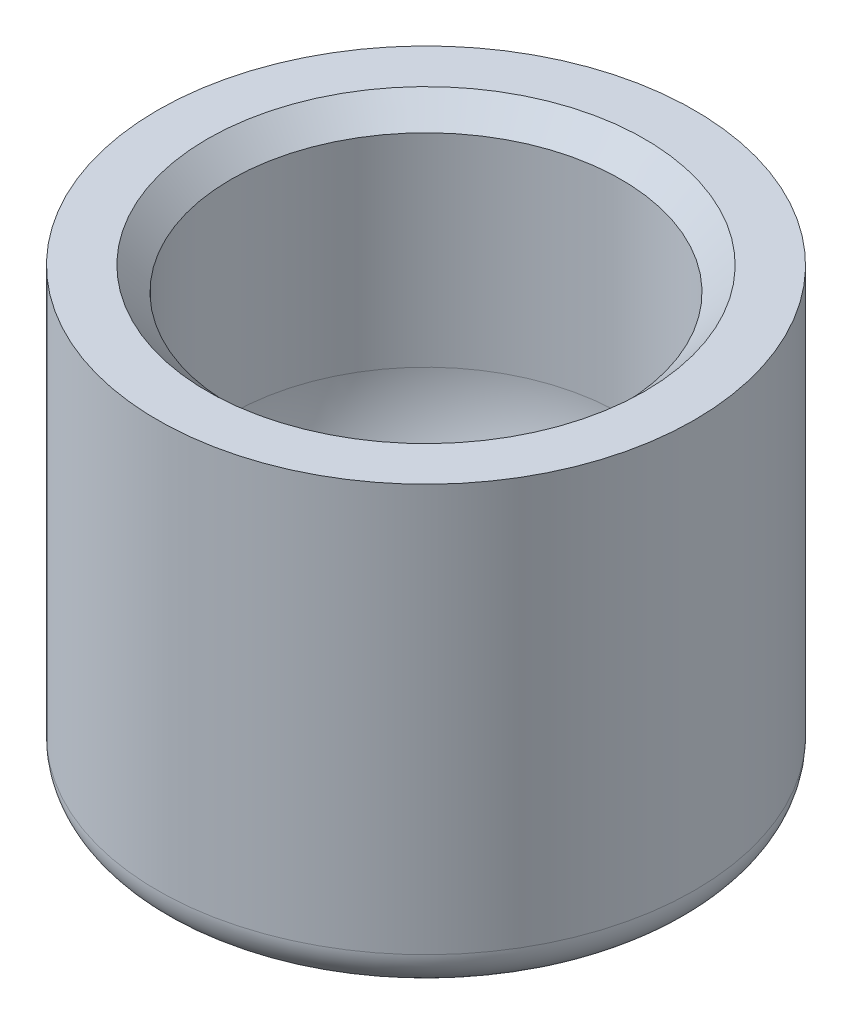
ISO-10303-21;
HEADER;
FILE_DESCRIPTION(('STEP AP214'),'2;1');
FILE_NAME('part.step','',(''),(''),'','','');
FILE_SCHEMA(('AUTOMOTIVE_DESIGN { 1 0 10303 214 1 1 1 1 }'));
ENDSEC;
DATA;
#1=APPLICATION_CONTEXT('core data for automotive mechanical design processes');
#2=APPLICATION_PROTOCOL_DEFINITION('international standard','automotive_design',2000,#1);
#3=PRODUCT_CONTEXT('',#1,'mechanical');
#4=PRODUCT('Part','Part','',(#3));
#5=PRODUCT_RELATED_PRODUCT_CATEGORY('part','',(#4));
#6=PRODUCT_DEFINITION_FORMATION('','',#4);
#7=PRODUCT_DEFINITION_CONTEXT('part definition',#1,'design');
#8=PRODUCT_DEFINITION('design','',#6,#7);
#9=PRODUCT_DEFINITION_SHAPE('','',#8);
#10=(LENGTH_UNIT() NAMED_UNIT(*) SI_UNIT(.MILLI.,.METRE.));
#11=(NAMED_UNIT(*) PLANE_ANGLE_UNIT() SI_UNIT($,.RADIAN.));
#12=(NAMED_UNIT(*) SI_UNIT($,.STERADIAN.) SOLID_ANGLE_UNIT());
#13=UNCERTAINTY_MEASURE_WITH_UNIT(LENGTH_MEASURE(1.E-05),#10,'distance_accuracy_value','');
#14=(GEOMETRIC_REPRESENTATION_CONTEXT(3) GLOBAL_UNCERTAINTY_ASSIGNED_CONTEXT((#13)) GLOBAL_UNIT_ASSIGNED_CONTEXT((#10,
#11,#12)) REPRESENTATION_CONTEXT('',''));
#15=CARTESIAN_POINT('',(0.,0.,0.));
#16=DIRECTION('',(0.,0.,1.));
#17=DIRECTION('',(1.,0.,0.));
#18=AXIS2_PLACEMENT_3D('',#15,#16,#17);
#19=CARTESIAN_POINT('',(0.,-13.716,0.));
#20=DIRECTION('',(0.,1.,0.));
#21=DIRECTION('',(-1.,0.,0.));
#22=AXIS2_PLACEMENT_3D('',#19,#20,#21);
#23=CYLINDRICAL_SURFACE('',#22,6.35);
#24=CARTESIAN_POINT('',(0.,-0.762000000000002,0.));
#25=DIRECTION('',(0.,-1.,0.));
#26=DIRECTION('',(1.,0.,0.));
#27=AXIS2_PLACEMENT_3D('',#24,#25,#26);
#28=CIRCLE('',#27,6.35);
#29=CARTESIAN_POINT('',(6.35,-0.762000000000002,0.));
#30=VERTEX_POINT('',#29);
#31=EDGE_CURVE('E46',#30,#30,#28,.F.);
#32=ORIENTED_EDGE('',*,*,#31,.T.);
#33=EDGE_LOOP('',(#32));
#34=FACE_BOUND('',#33,.T.);
#35=CARTESIAN_POINT('',(0.,-7.366,0.));
#36=DIRECTION('',(0.,1.,0.));
#37=DIRECTION('',(-1.,0.,0.));
#38=AXIS2_PLACEMENT_3D('',#35,#36,#37);
#39=CIRCLE('',#38,6.35);
#40=CARTESIAN_POINT('',(-6.35,-7.366,0.));
#41=VERTEX_POINT('',#40);
#42=EDGE_CURVE('E65',#41,#41,#39,.T.);
#43=ORIENTED_EDGE('',*,*,#42,.F.);
#44=EDGE_LOOP('',(#43));
#45=FACE_BOUND('',#44,.T.);
#46=ADVANCED_FACE('F39',(#34,#45),#23,.F.);
#47=CARTESIAN_POINT('',(6.35,0.,0.));
#48=DIRECTION('',(0.,-1.,0.));
#49=DIRECTION('',(1.,0.,0.));
#50=AXIS2_PLACEMENT_3D('',#47,#48,#49);
#51=PLANE('',#50);
#52=CARTESIAN_POINT('',(0.,0.,0.));
#53=DIRECTION('',(0.,-1.,0.));
#54=DIRECTION('',(1.,0.,0.));
#55=AXIS2_PLACEMENT_3D('',#52,#53,#54);
#56=CIRCLE('',#55,7.11200000000001);
#57=CARTESIAN_POINT('',(7.11200000000001,0.,0.));
#58=VERTEX_POINT('',#57);
#59=EDGE_CURVE('E10',#58,#58,#56,.T.);
#60=ORIENTED_EDGE('',*,*,#59,.T.);
#61=EDGE_LOOP('',(#60));
#62=FACE_BOUND('',#61,.T.);
#63=CARTESIAN_POINT('',(0.,0.,0.));
#64=DIRECTION('',(0.,1.,0.));
#65=DIRECTION('',(-1.,0.,0.));
#66=AXIS2_PLACEMENT_3D('',#63,#64,#65);
#67=CIRCLE('',#66,8.73125);
#68=CARTESIAN_POINT('',(-8.73125,0.,0.));
#69=VERTEX_POINT('',#68);
#70=EDGE_CURVE('E50',#69,#69,#67,.T.);
#71=ORIENTED_EDGE('',*,*,#70,.T.);
#72=EDGE_LOOP('',(#71));
#73=FACE_BOUND('',#72,.T.);
#74=ADVANCED_FACE('F72',(#62,#73),#51,.F.);
#75=CARTESIAN_POINT('',(0.,-13.716,0.));
#76=DIRECTION('',(0.,1.,0.));
#77=DIRECTION('',(-1.,0.,0.));
#78=AXIS2_PLACEMENT_3D('',#75,#76,#77);
#79=CYLINDRICAL_SURFACE('',#78,8.73125);
#80=ORIENTED_EDGE('',*,*,#70,.F.);
#81=EDGE_LOOP('',(#80));
#82=FACE_BOUND('',#81,.T.);
#83=CARTESIAN_POINT('',(0.,-13.2543508195075,0.));
#84=DIRECTION('',(0.,1.,0.));
#85=DIRECTION('',(-1.,0.,0.));
#86=AXIS2_PLACEMENT_3D('',#83,#84,#85);
#87=CIRCLE('',#86,8.73125);
#88=CARTESIAN_POINT('',(-8.73125,-13.2543508195075,0.));
#89=VERTEX_POINT('',#88);
#90=EDGE_CURVE('E54',#89,#89,#87,.T.);
#91=ORIENTED_EDGE('',*,*,#90,.T.);
#92=EDGE_LOOP('',(#91));
#93=FACE_BOUND('',#92,.T.);
#94=ADVANCED_FACE('F76',(#82,#93),#79,.T.);
#95=CARTESIAN_POINT('',(0.,-13.2543508195075,0.));
#96=DIRECTION('',(0.,1.,0.));
#97=DIRECTION('',(-1.,0.,0.));
#98=AXIS2_PLACEMENT_3D('',#95,#96,#97);
#99=TOROIDAL_SURFACE('',#98,7.46125,1.27);
#100=ORIENTED_EDGE('',*,*,#90,.F.);
#101=EDGE_LOOP('',(#100));
#102=FACE_BOUND('',#101,.T.);
#103=CARTESIAN_POINT('',(0.,-14.3406956364011,0.));
#104=DIRECTION('',(0.,1.,0.));
#105=DIRECTION('',(-1.,0.,0.));
#106=AXIS2_PLACEMENT_3D('',#103,#104,#105);
#107=CIRCLE('',#106,8.1190911197306);
#108=CARTESIAN_POINT('',(-8.1190911197306,-14.3406956364011,0.));
#109=VERTEX_POINT('',#108);
#110=EDGE_CURVE('E59',#109,#109,#107,.T.);
#111=ORIENTED_EDGE('',*,*,#110,.T.);
#112=EDGE_LOOP('',(#111));
#113=FACE_BOUND('',#112,.T.);
#114=ADVANCED_FACE('F83',(#102,#113),#99,.T.);
#115=CARTESIAN_POINT('',(0.,-18.8727215694265,0.));
#116=DIRECTION('',(0.,1.,0.));
#117=DIRECTION('',(-1.,0.,0.));
#118=AXIS2_PLACEMENT_3D('',#115,#116,#117);
#119=CONICAL_SURFACE('',#118,0.635,1.02630255604817);
#120=CARTESIAN_POINT('',(0.,-18.8727215694265,0.));
#121=DIRECTION('',(0.,1.,0.));
#122=DIRECTION('',(-1.,0.,0.));
#123=AXIS2_PLACEMENT_3D('',#120,#121,#122);
#124=CIRCLE('',#123,0.635);
#125=CARTESIAN_POINT('',(-0.634999999999997,-18.8727215694265,0.));
#126=VERTEX_POINT('',#125);
#127=EDGE_CURVE('E62',#126,#126,#124,.T.);
#128=CARTESIAN_POINT('',(-8.1190911197306,-14.3406956364011,0.));
#129=CARTESIAN_POINT('',(-8.04113183723341,-14.3879042398702,0.));
#130=CARTESIAN_POINT('',(-7.96317255473621,-14.4351128433392,0.));
#131=CARTESIAN_POINT('',(-7.80725398974183,-14.5295300502772,0.));
#132=CARTESIAN_POINT('',(-7.72929470724463,-14.5767386537462,0.));
#133=CARTESIAN_POINT('',(-7.57337614225024,-14.6711558606842,0.));
#134=CARTESIAN_POINT('',(-7.49541685975305,-14.7183644641533,0.));
#135=CARTESIAN_POINT('',(-7.33949829475866,-14.8127816710913,0.));
#136=CARTESIAN_POINT('',(-7.26153901226147,-14.8599902745603,0.));
#137=CARTESIAN_POINT('',(-7.10562044726708,-14.9544074814983,0.));
#138=CARTESIAN_POINT('',(-7.02766116476989,-15.0016160849673,0.));
#139=CARTESIAN_POINT('',(-6.8717425997755,-15.0960332919054,0.));
#140=CARTESIAN_POINT('',(-6.79378331727831,-15.1432418953744,0.));
#141=CARTESIAN_POINT('',(-6.63786475228392,-15.2376591023124,0.));
#142=CARTESIAN_POINT('',(-6.55990546978673,-15.2848677057814,0.));
#143=CARTESIAN_POINT('',(-6.40398690479234,-15.3792849127195,0.));
#144=CARTESIAN_POINT('',(-6.32602762229514,-15.4264935161885,0.));
#145=CARTESIAN_POINT('',(-6.17010905730076,-15.5209107231265,0.));
#146=CARTESIAN_POINT('',(-6.09214977480356,-15.5681193265955,0.));
#147=CARTESIAN_POINT('',(-5.93623120980917,-15.6625365335335,0.));
#148=CARTESIAN_POINT('',(-5.85827192731198,-15.7097451370026,0.));
#149=CARTESIAN_POINT('',(-5.70235336231759,-15.8041623439406,0.));
#150=CARTESIAN_POINT('',(-5.6243940798204,-15.8513709474096,0.));
#151=CARTESIAN_POINT('',(-5.46847551482601,-15.9457881543476,0.));
#152=CARTESIAN_POINT('',(-5.39051623232882,-15.9929967578166,0.));
#153=CARTESIAN_POINT('',(-5.23459766733443,-16.0874139647547,0.));
#154=CARTESIAN_POINT('',(-5.15663838483724,-16.1346225682237,0.));
#155=CARTESIAN_POINT('',(-5.00071981984285,-16.2290397751617,0.));
#156=CARTESIAN_POINT('',(-4.92276053734566,-16.2762483786307,0.));
#157=CARTESIAN_POINT('',(-4.76684197235127,-16.3706655855687,0.));
#158=CARTESIAN_POINT('',(-4.68888268985407,-16.4178741890378,0.));
#159=CARTESIAN_POINT('',(-4.53296412485969,-16.5122913959758,0.));
#160=CARTESIAN_POINT('',(-4.45500484236249,-16.5594999994448,0.));
#161=CARTESIAN_POINT('',(-4.2990862773681,-16.6539172063828,0.));
#162=CARTESIAN_POINT('',(-4.22112699487091,-16.7011258098518,0.));
#163=CARTESIAN_POINT('',(-4.06520842987652,-16.7955430167899,0.));
#164=CARTESIAN_POINT('',(-3.98724914737933,-16.8427516202589,0.));
#165=CARTESIAN_POINT('',(-3.83133058238494,-16.9371688271969,0.));
#166=CARTESIAN_POINT('',(-3.75337129988775,-16.9843774306659,0.));
#167=CARTESIAN_POINT('',(-3.59745273489336,-17.078794637604,0.));
#168=CARTESIAN_POINT('',(-3.51949345239617,-17.126003241073,0.));
#169=CARTESIAN_POINT('',(-3.36357488740178,-17.220420448011,0.));
#170=CARTESIAN_POINT('',(-3.28561560490459,-17.26762905148,0.));
#171=CARTESIAN_POINT('',(-3.1296970399102,-17.362046258418,0.));
#172=CARTESIAN_POINT('',(-3.051737757413,-17.4092548618871,0.));
#173=CARTESIAN_POINT('',(-2.89581919241862,-17.5036720688251,0.));
#174=CARTESIAN_POINT('',(-2.81785990992142,-17.5508806722941,0.));
#175=CARTESIAN_POINT('',(-2.66194134492704,-17.6452978792321,0.));
#176=CARTESIAN_POINT('',(-2.58398206242984,-17.6925064827011,0.));
#177=CARTESIAN_POINT('',(-2.42806349743545,-17.7869236896392,0.));
#178=CARTESIAN_POINT('',(-2.35010421493826,-17.8341322931082,0.));
#179=CARTESIAN_POINT('',(-2.19418564994387,-17.9285495000462,0.));
#180=CARTESIAN_POINT('',(-2.11622636744668,-17.9757581035152,0.));
#181=CARTESIAN_POINT('',(-1.96030780245229,-18.0701753104533,0.));
#182=CARTESIAN_POINT('',(-1.8823485199551,-18.1173839139223,0.));
#183=CARTESIAN_POINT('',(-1.72642995496071,-18.2118011208603,0.));
#184=CARTESIAN_POINT('',(-1.64847067246352,-18.2590097243293,0.));
#185=CARTESIAN_POINT('',(-1.49255210746913,-18.3534269312673,0.));
#186=CARTESIAN_POINT('',(-1.41459282497194,-18.4006355347363,0.));
#187=CARTESIAN_POINT('',(-1.25867425997755,-18.4950527416744,0.));
#188=CARTESIAN_POINT('',(-1.18071497748035,-18.5422613451434,0.));
#189=CARTESIAN_POINT('',(-1.02479641248597,-18.6366785520814,0.));
#190=CARTESIAN_POINT('',(-0.946837129988772,-18.6838871555504,0.));
#191=CARTESIAN_POINT('',(-0.790918564994385,-18.7783043624885,0.));
#192=CARTESIAN_POINT('',(-0.712959282497191,-18.8255129659575,0.));
#193=CARTESIAN_POINT('',(-0.634999999999997,-18.8727215694265,0.));
#194=B_SPLINE_CURVE_WITH_KNOTS('',3,(#128,#129,#130,#131,#132,#133,#134,#135,#136,#137,#138,
#139,#140,#141,#142,#143,#144,#145,#146,#147,#148,#149,#150,#151,#152,#153,#154,#155,#156,#157,
#158,#159,#160,#161,#162,#163,#164,#165,#166,#167,#168,#169,#170,#171,#172,#173,#174,#175,#176,
#177,#178,#179,#180,#181,#182,#183,#184,#185,#186,#187,#188,#189,#190,#191,#192,#193),
.UNSPECIFIED.,.F.,.F.,(4,2,2,2,2,2,2,2,2,2,2,2,2,2,2,2,2,2,2,2,2,2,2,2,2,2,2,2,2,2,2,2,4),(0.,
0.273416747330419,0.54683349466084,0.820250241991261,1.09366698932168,1.3670837366521,
1.64050048398252,1.91391723131294,2.18733397864336,2.46075072597378,2.7341674733042,
3.00758422063462,3.28100096796504,3.55441771529546,3.82783446262588,4.1012512099563,
4.37466795728672,4.64808470461714,4.92150145194756,5.19491819927798,5.4683349466084,
5.74175169393882,6.01516844126924,6.28858518859966,6.56200193593008,6.83541868326051,
7.10883543059092,7.38225217792134,7.65566892525177,7.92908567258218,8.2025024199126,
8.47591916724302,8.74933591457344),.UNSPECIFIED.);
#195=EDGE_CURVE('BSEAM87',#109,#126,#194,.T.);
#196=ORIENTED_EDGE('',*,*,#110,.F.);
#197=ORIENTED_EDGE('',*,*,#127,.T.);
#198=ORIENTED_EDGE('',*,*,#195,.T.);
#199=ORIENTED_EDGE('',*,*,#195,.F.);
#200=EDGE_LOOP('',(#196,#198,#197,#199));
#201=FACE_BOUND('',#200,.T.);
#202=ADVANCED_FACE('F87',(#201),#119,.T.);
#203=CARTESIAN_POINT('',(0.,-17.8240960912716,0.));
#204=DIRECTION('',(0.,1.,0.));
#205=DIRECTION('',(1.,0.,0.));
#206=AXIS2_PLACEMENT_3D('',#203,#204,#205);
#207=SPHERICAL_SURFACE('',#206,1.22590390872838);
#208=ORIENTED_EDGE('',*,*,#127,.F.);
#209=EDGE_LOOP('',(#208));
#210=FACE_BOUND('',#209,.T.);
#211=ADVANCED_FACE('F91',(#210),#207,.T.);
#212=CARTESIAN_POINT('',(0.,-7.366,0.));
#213=DIRECTION('',(0.,1.,0.));
#214=DIRECTION('',(1.,0.,0.));
#215=AXIS2_PLACEMENT_3D('',#212,#213,#214);
#216=SPHERICAL_SURFACE('',#215,6.35);
#217=ORIENTED_EDGE('',*,*,#42,.T.);
#218=EDGE_LOOP('',(#217));
#219=FACE_BOUND('',#218,.T.);
#220=ADVANCED_FACE('F69',(#219),#216,.F.);
#221=CARTESIAN_POINT('',(0.,-0.762000000000002,0.));
#222=DIRECTION('',(0.,1.,0.));
#223=DIRECTION('',(-1.,0.,0.));
#224=AXIS2_PLACEMENT_3D('',#221,#222,#223);
#225=CONICAL_SURFACE('',#224,6.35,0.785398163397451);
#226=ORIENTED_EDGE('',*,*,#59,.F.);
#227=EDGE_LOOP('',(#226));
#228=FACE_BOUND('',#227,.T.);
#229=ORIENTED_EDGE('',*,*,#31,.F.);
#230=EDGE_LOOP('',(#229));
#231=FACE_BOUND('',#230,.T.);
#232=ADVANCED_FACE('F41',(#228,#231),#225,.F.);
#233=CLOSED_SHELL('',(#46,#74,#94,#114,#202,#211,#220,#232));
#234=MANIFOLD_SOLID_BREP('B2',#233);
#235=ADVANCED_BREP_SHAPE_REPRESENTATION('',(#18,#234),#14);
#236=SHAPE_DEFINITION_REPRESENTATION(#9,#235);
ENDSEC;
END-ISO-10303-21;
